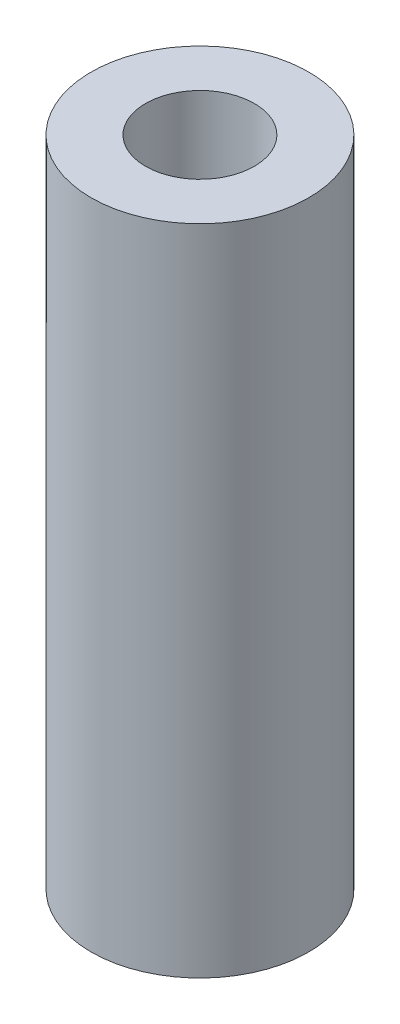
ISO-10303-21;
HEADER;
FILE_DESCRIPTION(('STEP AP214'),'2;1');
FILE_NAME('part.step','',(''),(''),'','','');
FILE_SCHEMA(('AUTOMOTIVE_DESIGN { 1 0 10303 214 1 1 1 1 }'));
ENDSEC;
DATA;
#1=APPLICATION_CONTEXT('core data for automotive mechanical design processes');
#2=APPLICATION_PROTOCOL_DEFINITION('international standard','automotive_design',2000,#1);
#3=PRODUCT_CONTEXT('',#1,'mechanical');
#4=PRODUCT('Part','Part','',(#3));
#5=PRODUCT_RELATED_PRODUCT_CATEGORY('part','',(#4));
#6=PRODUCT_DEFINITION_FORMATION('','',#4);
#7=PRODUCT_DEFINITION_CONTEXT('part definition',#1,'design');
#8=PRODUCT_DEFINITION('design','',#6,#7);
#9=PRODUCT_DEFINITION_SHAPE('','',#8);
#10=(LENGTH_UNIT() NAMED_UNIT(*) SI_UNIT(.MILLI.,.METRE.));
#11=(NAMED_UNIT(*) PLANE_ANGLE_UNIT() SI_UNIT($,.RADIAN.));
#12=(NAMED_UNIT(*) SI_UNIT($,.STERADIAN.) SOLID_ANGLE_UNIT());
#13=UNCERTAINTY_MEASURE_WITH_UNIT(LENGTH_MEASURE(1.E-05),#10,'distance_accuracy_value','');
#14=(GEOMETRIC_REPRESENTATION_CONTEXT(3) GLOBAL_UNCERTAINTY_ASSIGNED_CONTEXT((#13)) GLOBAL_UNIT_ASSIGNED_CONTEXT((#10,
#11,#12)) REPRESENTATION_CONTEXT('',''));
#15=CARTESIAN_POINT('',(0.,0.,0.));
#16=DIRECTION('',(0.,0.,1.));
#17=DIRECTION('',(1.,0.,0.));
#18=AXIS2_PLACEMENT_3D('',#15,#16,#17);
#19=CARTESIAN_POINT('',(0.,15.,0.));
#20=DIRECTION('',(0.,1.,0.));
#21=DIRECTION('',(0.,0.,1.));
#22=AXIS2_PLACEMENT_3D('',#19,#20,#21);
#23=PLANE('',#22);
#24=CARTESIAN_POINT('',(0.,15.,0.));
#25=DIRECTION('',(0.,1.,0.));
#26=DIRECTION('',(0.,0.,1.));
#27=AXIS2_PLACEMENT_3D('',#24,#25,#26);
#28=CIRCLE('',#27,2.5);
#29=CARTESIAN_POINT('',(0.,15.,2.5));
#30=VERTEX_POINT('',#29);
#31=EDGE_CURVE('E10',#30,#30,#28,.T.);
#32=ORIENTED_EDGE('',*,*,#31,.T.);
#33=EDGE_LOOP('',(#32));
#34=FACE_BOUND('',#33,.T.);
#35=CARTESIAN_POINT('',(0.,15.,0.));
#36=DIRECTION('',(0.,1.,0.));
#37=DIRECTION('',(0.,0.,1.));
#38=AXIS2_PLACEMENT_3D('',#35,#36,#37);
#39=CIRCLE('',#38,1.25);
#40=CARTESIAN_POINT('',(0.,15.,1.25));
#41=VERTEX_POINT('',#40);
#42=EDGE_CURVE('E46',#41,#41,#39,.T.);
#43=ORIENTED_EDGE('',*,*,#42,.F.);
#44=EDGE_LOOP('',(#43));
#45=FACE_BOUND('',#44,.T.);
#46=ADVANCED_FACE('F35',(#34,#45),#23,.T.);
#47=CARTESIAN_POINT('',(0.,0.,0.));
#48=DIRECTION('',(0.,1.,0.));
#49=DIRECTION('',(0.,0.,1.));
#50=AXIS2_PLACEMENT_3D('',#47,#48,#49);
#51=PLANE('',#50);
#52=CARTESIAN_POINT('',(0.,0.,0.));
#53=DIRECTION('',(0.,1.,0.));
#54=DIRECTION('',(0.,0.,1.));
#55=AXIS2_PLACEMENT_3D('',#52,#53,#54);
#56=CIRCLE('',#55,2.5);
#57=CARTESIAN_POINT('',(0.,0.,2.5));
#58=VERTEX_POINT('',#57);
#59=EDGE_CURVE('E39',#58,#58,#56,.T.);
#60=ORIENTED_EDGE('',*,*,#59,.F.);
#61=EDGE_LOOP('',(#60));
#62=FACE_BOUND('',#61,.T.);
#63=CARTESIAN_POINT('',(0.,0.,0.));
#64=DIRECTION('',(0.,1.,0.));
#65=DIRECTION('',(0.,0.,1.));
#66=AXIS2_PLACEMENT_3D('',#63,#64,#65);
#67=CIRCLE('',#66,1.25);
#68=CARTESIAN_POINT('',(0.,0.,1.25));
#69=VERTEX_POINT('',#68);
#70=EDGE_CURVE('E48',#69,#69,#67,.T.);
#71=ORIENTED_EDGE('',*,*,#70,.T.);
#72=EDGE_LOOP('',(#71));
#73=FACE_BOUND('',#72,.T.);
#74=ADVANCED_FACE('F58',(#62,#73),#51,.F.);
#75=CARTESIAN_POINT('',(0.,15.,0.));
#76=DIRECTION('',(0.,-1.,0.));
#77=DIRECTION('',(0.,0.,-1.));
#78=AXIS2_PLACEMENT_3D('',#75,#76,#77);
#79=CYLINDRICAL_SURFACE('',#78,2.5);
#80=ORIENTED_EDGE('',*,*,#31,.F.);
#81=EDGE_LOOP('',(#80));
#82=FACE_BOUND('',#81,.T.);
#83=ORIENTED_EDGE('',*,*,#59,.T.);
#84=EDGE_LOOP('',(#83));
#85=FACE_BOUND('',#84,.T.);
#86=ADVANCED_FACE('F37',(#82,#85),#79,.T.);
#87=CARTESIAN_POINT('',(0.,15.,0.));
#88=DIRECTION('',(0.,-1.,0.));
#89=DIRECTION('',(0.,0.,-1.));
#90=AXIS2_PLACEMENT_3D('',#87,#88,#89);
#91=CYLINDRICAL_SURFACE('',#90,1.25);
#92=ORIENTED_EDGE('',*,*,#42,.T.);
#93=EDGE_LOOP('',(#92));
#94=FACE_BOUND('',#93,.T.);
#95=ORIENTED_EDGE('',*,*,#70,.F.);
#96=EDGE_LOOP('',(#95));
#97=FACE_BOUND('',#96,.T.);
#98=ADVANCED_FACE('F54',(#94,#97),#91,.F.);
#99=CLOSED_SHELL('',(#46,#74,#86,#98));
#100=MANIFOLD_SOLID_BREP('B2',#99);
#101=ADVANCED_BREP_SHAPE_REPRESENTATION('',(#18,#100),#14);
#102=SHAPE_DEFINITION_REPRESENTATION(#9,#101);
ENDSEC;
END-ISO-10303-21;
